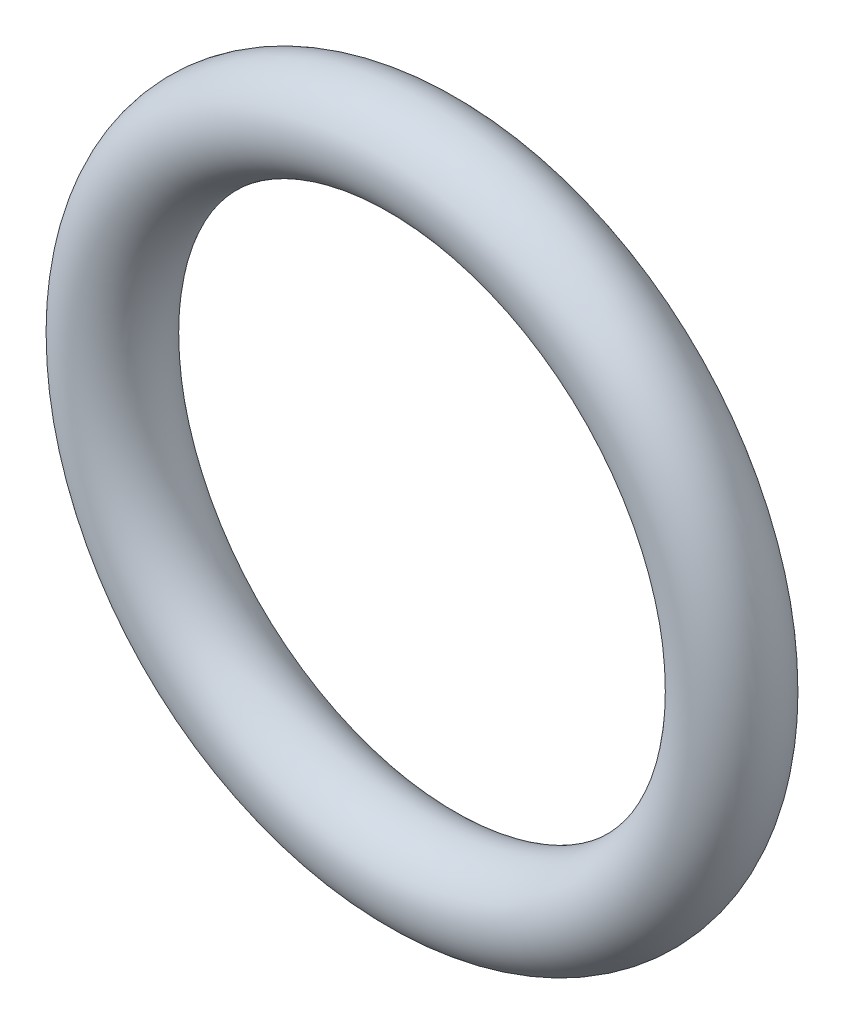
ISO-10303-21;
HEADER;
FILE_DESCRIPTION(('STEP AP214'),'2;1');
FILE_NAME('part.step','',(''),(''),'','','');
FILE_SCHEMA(('AUTOMOTIVE_DESIGN { 1 0 10303 214 1 1 1 1 }'));
ENDSEC;
DATA;
#1=APPLICATION_CONTEXT('core data for automotive mechanical design processes');
#2=APPLICATION_PROTOCOL_DEFINITION('international standard','automotive_design',2000,#1);
#3=PRODUCT_CONTEXT('',#1,'mechanical');
#4=PRODUCT('Part','Part','',(#3));
#5=PRODUCT_RELATED_PRODUCT_CATEGORY('part','',(#4));
#6=PRODUCT_DEFINITION_FORMATION('','',#4);
#7=PRODUCT_DEFINITION_CONTEXT('part definition',#1,'design');
#8=PRODUCT_DEFINITION('design','',#6,#7);
#9=PRODUCT_DEFINITION_SHAPE('','',#8);
#10=(LENGTH_UNIT() NAMED_UNIT(*) SI_UNIT(.MILLI.,.METRE.));
#11=(NAMED_UNIT(*) PLANE_ANGLE_UNIT() SI_UNIT($,.RADIAN.));
#12=(NAMED_UNIT(*) SI_UNIT($,.STERADIAN.) SOLID_ANGLE_UNIT());
#13=UNCERTAINTY_MEASURE_WITH_UNIT(LENGTH_MEASURE(1.E-05),#10,'distance_accuracy_value','');
#14=(GEOMETRIC_REPRESENTATION_CONTEXT(3) GLOBAL_UNCERTAINTY_ASSIGNED_CONTEXT((#13)) GLOBAL_UNIT_ASSIGNED_CONTEXT((#10,
#11,#12)) REPRESENTATION_CONTEXT('',''));
#15=CARTESIAN_POINT('',(0.,0.,0.));
#16=DIRECTION('',(0.,0.,1.));
#17=DIRECTION('',(1.,0.,0.));
#18=AXIS2_PLACEMENT_3D('',#15,#16,#17);
#19=CARTESIAN_POINT('',(0.,0.,0.));
#20=DIRECTION('',(0.,0.,1.));
#21=DIRECTION('',(1.,0.,0.));
#22=AXIS2_PLACEMENT_3D('',#19,#20,#21);
#23=TOROIDAL_SURFACE('',#22,8.25,1.25);
#24=CARTESIAN_POINT('',(9.5,0.,0.));
#25=VERTEX_POINT('',#24);
#26=VERTEX_LOOP('',#25);
#27=FACE_BOUND('',#26,.T.);
#28=ADVANCED_FACE('F34',(#27),#23,.T.);
#29=CLOSED_SHELL('',(#28));
#30=MANIFOLD_SOLID_BREP('B2',#29);
#31=ADVANCED_BREP_SHAPE_REPRESENTATION('',(#18,#30),#14);
#32=SHAPE_DEFINITION_REPRESENTATION(#9,#31);
ENDSEC;
END-ISO-10303-21;
